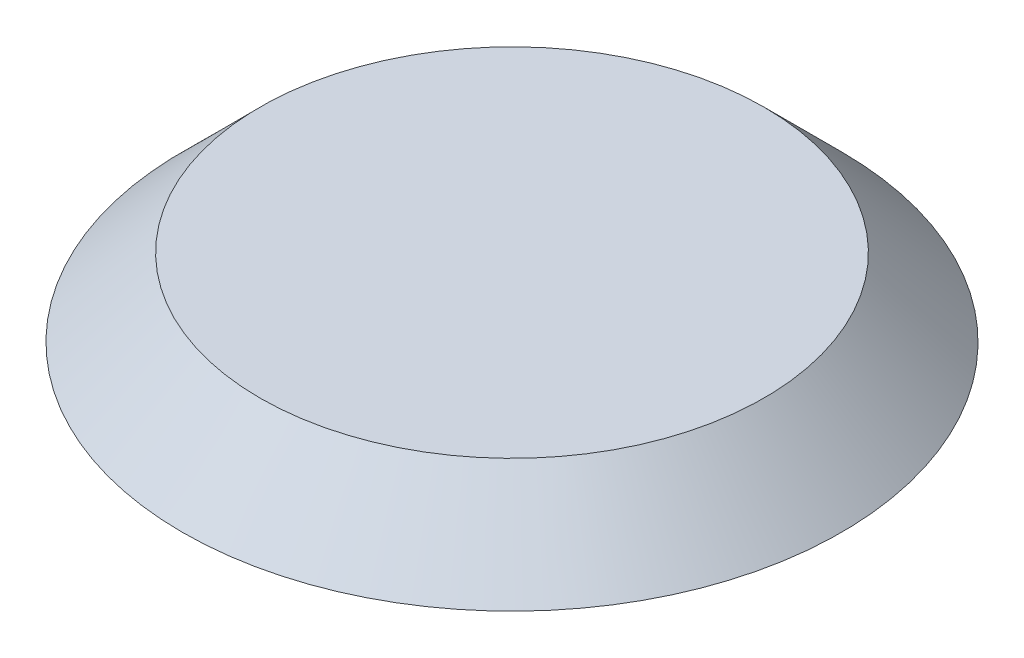
ISO-10303-21;
HEADER;
FILE_DESCRIPTION(('STEP AP214'),'2;1');
FILE_NAME('part.step','',(''),(''),'','','');
FILE_SCHEMA(('AUTOMOTIVE_DESIGN { 1 0 10303 214 1 1 1 1 }'));
ENDSEC;
DATA;
#1=APPLICATION_CONTEXT('core data for automotive mechanical design processes');
#2=APPLICATION_PROTOCOL_DEFINITION('international standard','automotive_design',2000,#1);
#3=PRODUCT_CONTEXT('',#1,'mechanical');
#4=PRODUCT('Part','Part','',(#3));
#5=PRODUCT_RELATED_PRODUCT_CATEGORY('part','',(#4));
#6=PRODUCT_DEFINITION_FORMATION('','',#4);
#7=PRODUCT_DEFINITION_CONTEXT('part definition',#1,'design');
#8=PRODUCT_DEFINITION('design','',#6,#7);
#9=PRODUCT_DEFINITION_SHAPE('','',#8);
#10=(LENGTH_UNIT() NAMED_UNIT(*) SI_UNIT(.MILLI.,.METRE.));
#11=(NAMED_UNIT(*) PLANE_ANGLE_UNIT() SI_UNIT($,.RADIAN.));
#12=(NAMED_UNIT(*) SI_UNIT($,.STERADIAN.) SOLID_ANGLE_UNIT());
#13=UNCERTAINTY_MEASURE_WITH_UNIT(LENGTH_MEASURE(1.E-05),#10,'distance_accuracy_value','');
#14=(GEOMETRIC_REPRESENTATION_CONTEXT(3) GLOBAL_UNCERTAINTY_ASSIGNED_CONTEXT((#13)) GLOBAL_UNIT_ASSIGNED_CONTEXT((#10,
#11,#12)) REPRESENTATION_CONTEXT('',''));
#15=CARTESIAN_POINT('',(0.,0.,0.));
#16=DIRECTION('',(0.,0.,1.));
#17=DIRECTION('',(1.,0.,0.));
#18=AXIS2_PLACEMENT_3D('',#15,#16,#17);
#19=CARTESIAN_POINT('',(0.,2.,0.));
#20=DIRECTION('',(0.,1.,0.));
#21=DIRECTION('',(0.,0.,1.));
#22=AXIS2_PLACEMENT_3D('',#19,#20,#21);
#23=PLANE('',#22);
#24=CARTESIAN_POINT('',(0.,2.,0.));
#25=DIRECTION('',(0.,1.,0.));
#26=DIRECTION('',(0.,0.,1.));
#27=AXIS2_PLACEMENT_3D('',#24,#25,#26);
#28=CIRCLE('',#27,6.5);
#29=CARTESIAN_POINT('',(0.,2.,6.5));
#30=VERTEX_POINT('',#29);
#31=EDGE_CURVE('E40',#30,#30,#28,.T.);
#32=ORIENTED_EDGE('',*,*,#31,.T.);
#33=EDGE_LOOP('',(#32));
#34=FACE_BOUND('',#33,.T.);
#35=ADVANCED_FACE('F33',(#34),#23,.T.);
#36=CARTESIAN_POINT('',(0.,0.,0.));
#37=DIRECTION('',(0.,1.,0.));
#38=DIRECTION('',(0.,0.,1.));
#39=AXIS2_PLACEMENT_3D('',#36,#37,#38);
#40=PLANE('',#39);
#41=CARTESIAN_POINT('',(0.,0.,0.));
#42=DIRECTION('',(0.,1.,0.));
#43=DIRECTION('',(0.,0.,1.));
#44=AXIS2_PLACEMENT_3D('',#41,#42,#43);
#45=CIRCLE('',#44,0.8);
#46=CARTESIAN_POINT('',(0.,0.,0.8));
#47=VERTEX_POINT('',#46);
#48=EDGE_CURVE('E10',#47,#47,#45,.F.);
#49=ORIENTED_EDGE('',*,*,#48,.F.);
#50=EDGE_LOOP('',(#49));
#51=FACE_BOUND('',#50,.T.);
#52=CARTESIAN_POINT('',(0.,0.,0.));
#53=DIRECTION('',(0.,1.,0.));
#54=DIRECTION('',(0.,0.,1.));
#55=AXIS2_PLACEMENT_3D('',#52,#53,#54);
#56=CIRCLE('',#55,8.5);
#57=CARTESIAN_POINT('',(0.,0.,8.5));
#58=VERTEX_POINT('',#57);
#59=EDGE_CURVE('E44',#58,#58,#56,.T.);
#60=ORIENTED_EDGE('',*,*,#59,.F.);
#61=EDGE_LOOP('',(#60));
#62=FACE_BOUND('',#61,.T.);
#63=ADVANCED_FACE('F64',(#51,#62),#40,.F.);
#64=CARTESIAN_POINT('',(0.,2.,0.));
#65=DIRECTION('',(0.,-1.,0.));
#66=DIRECTION('',(0.,0.,-1.));
#67=AXIS2_PLACEMENT_3D('',#64,#65,#66);
#68=CONICAL_SURFACE('',#67,6.5,0.785398163397447);
#69=ORIENTED_EDGE('',*,*,#59,.T.);
#70=EDGE_LOOP('',(#69));
#71=FACE_BOUND('',#70,.T.);
#72=ORIENTED_EDGE('',*,*,#31,.F.);
#73=EDGE_LOOP('',(#72));
#74=FACE_BOUND('',#73,.T.);
#75=ADVANCED_FACE('F35',(#71,#74),#68,.T.);
#76=CARTESIAN_POINT('',(0.,-0.4,0.));
#77=DIRECTION('',(0.,1.,0.));
#78=DIRECTION('',(0.,0.,1.));
#79=AXIS2_PLACEMENT_3D('',#76,#77,#78);
#80=CYLINDRICAL_SURFACE('',#79,0.8);
#81=CARTESIAN_POINT('',(0.,-0.4,0.));
#82=DIRECTION('',(0.,-1.,0.));
#83=DIRECTION('',(0.,0.,-1.));
#84=AXIS2_PLACEMENT_3D('',#81,#82,#83);
#85=CIRCLE('',#84,0.8);
#86=CARTESIAN_POINT('',(0.,-0.4,-0.8));
#87=VERTEX_POINT('',#86);
#88=EDGE_CURVE('E48',#87,#87,#85,.T.);
#89=ORIENTED_EDGE('',*,*,#88,.F.);
#90=EDGE_LOOP('',(#89));
#91=FACE_BOUND('',#90,.T.);
#92=ORIENTED_EDGE('',*,*,#48,.T.);
#93=EDGE_LOOP('',(#92));
#94=FACE_BOUND('',#93,.T.);
#95=ADVANCED_FACE('F56',(#91,#94),#80,.T.);
#96=CARTESIAN_POINT('',(0.,-0.4,0.));
#97=DIRECTION('',(0.,-1.,0.));
#98=DIRECTION('',(0.,0.,-1.));
#99=AXIS2_PLACEMENT_3D('',#96,#97,#98);
#100=PLANE('',#99);
#101=ORIENTED_EDGE('',*,*,#88,.T.);
#102=EDGE_LOOP('',(#101));
#103=FACE_BOUND('',#102,.T.);
#104=ADVANCED_FACE('F54',(#103),#100,.T.);
#105=CLOSED_SHELL('',(#35,#63,#75,#95,#104));
#106=MANIFOLD_SOLID_BREP('B2',#105);
#107=ADVANCED_BREP_SHAPE_REPRESENTATION('',(#18,#106),#14);
#108=SHAPE_DEFINITION_REPRESENTATION(#9,#107);
ENDSEC;
END-ISO-10303-21;
